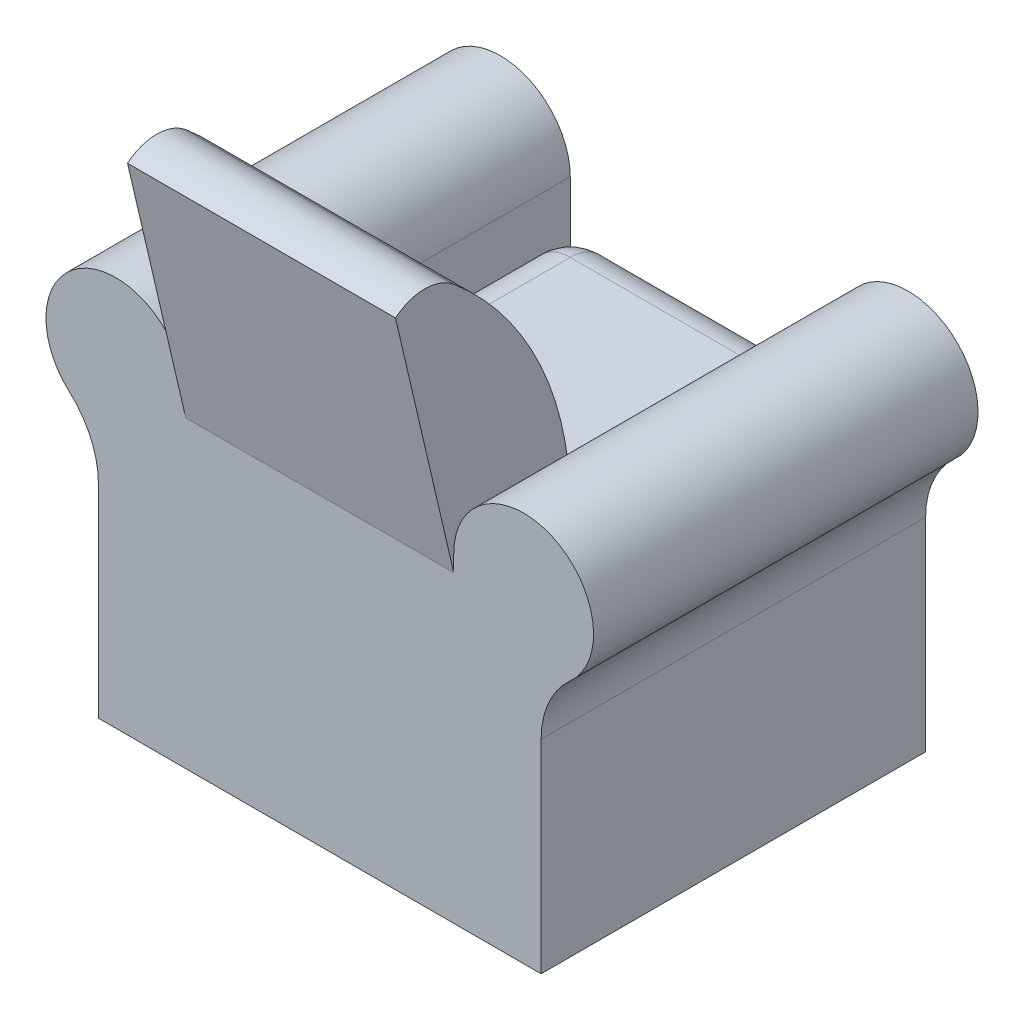
ISO-10303-21;
HEADER;
FILE_DESCRIPTION(('STEP AP214'),'2;1');
FILE_NAME('part.step','',(''),(''),'','','');
FILE_SCHEMA(('AUTOMOTIVE_DESIGN { 1 0 10303 214 1 1 1 1 }'));
ENDSEC;
DATA;
#1=APPLICATION_CONTEXT('core data for automotive mechanical design processes');
#2=APPLICATION_PROTOCOL_DEFINITION('international standard','automotive_design',2000,#1);
#3=PRODUCT_CONTEXT('',#1,'mechanical');
#4=PRODUCT('Part','Part','',(#3));
#5=PRODUCT_RELATED_PRODUCT_CATEGORY('part','',(#4));
#6=PRODUCT_DEFINITION_FORMATION('','',#4);
#7=PRODUCT_DEFINITION_CONTEXT('part definition',#1,'design');
#8=PRODUCT_DEFINITION('design','',#6,#7);
#9=PRODUCT_DEFINITION_SHAPE('','',#8);
#10=(LENGTH_UNIT() NAMED_UNIT(*) SI_UNIT(.MILLI.,.METRE.));
#11=(NAMED_UNIT(*) PLANE_ANGLE_UNIT() SI_UNIT($,.RADIAN.));
#12=(NAMED_UNIT(*) SI_UNIT($,.STERADIAN.) SOLID_ANGLE_UNIT());
#13=UNCERTAINTY_MEASURE_WITH_UNIT(LENGTH_MEASURE(1.E-05),#10,'distance_accuracy_value','');
#14=(GEOMETRIC_REPRESENTATION_CONTEXT(3) GLOBAL_UNCERTAINTY_ASSIGNED_CONTEXT((#13)) GLOBAL_UNIT_ASSIGNED_CONTEXT((#10,
#11,#12)) REPRESENTATION_CONTEXT('',''));
#15=CARTESIAN_POINT('',(0.,0.,0.));
#16=DIRECTION('',(0.,0.,1.));
#17=DIRECTION('',(1.,0.,0.));
#18=AXIS2_PLACEMENT_3D('',#15,#16,#17);
#19=CARTESIAN_POINT('',(1243.60088541004,0.,230.));
#20=DIRECTION('',(0.,0.,-1.));
#21=DIRECTION('',(0.,1.,0.));
#22=AXIS2_PLACEMENT_3D('',#19,#20,#21);
#23=PLANE('',#22);
#24=DIRECTION('',(0.,1.,0.));
#25=VECTOR('',#24,1.);
#26=CARTESIAN_POINT('',(230.,0.,230.));
#27=LINE('',#26,#25);
#28=CARTESIAN_POINT('',(230.,350.,230.));
#29=VERTEX_POINT('',#28);
#30=CARTESIAN_POINT('',(230.,521.319166654697,230.));
#31=VERTEX_POINT('',#30);
#32=EDGE_CURVE('E440',#29,#31,#27,.T.);
#33=ORIENTED_EDGE('',*,*,#32,.F.);
#34=DIRECTION('',(1.,0.,0.));
#35=VECTOR('',#34,1.);
#36=CARTESIAN_POINT('',(230.,350.,230.));
#37=LINE('',#36,#35);
#38=CARTESIAN_POINT('',(-230.,350.,230.));
#39=VERTEX_POINT('',#38);
#40=EDGE_CURVE('E465',#39,#29,#37,.T.);
#41=ORIENTED_EDGE('',*,*,#40,.F.);
#42=DIRECTION('',(0.,-1.,0.));
#43=VECTOR('',#42,1.);
#44=CARTESIAN_POINT('',(-230.,0.,230.));
#45=LINE('',#44,#43);
#46=CARTESIAN_POINT('',(-230.,521.319166654697,230.));
#47=VERTEX_POINT('',#46);
#48=EDGE_CURVE('E450',#47,#39,#45,.T.);
#49=ORIENTED_EDGE('',*,*,#48,.F.);
#50=DIRECTION('',(-1.,0.,0.));
#51=VECTOR('',#50,1.);
#52=CARTESIAN_POINT('',(1243.60088541004,521.319166654697,230.));
#53=LINE('',#52,#51);
#54=EDGE_CURVE('E434',#31,#47,#53,.T.);
#55=ORIENTED_EDGE('',*,*,#54,.F.);
#56=EDGE_LOOP('',(#33,#41,#49,#55));
#57=FACE_BOUND('',#56,.T.);
#58=DIRECTION('',(0.,-1.,0.));
#59=VECTOR('',#58,1.);
#60=CARTESIAN_POINT('',(-160.,500.,230.));
#61=LINE('',#60,#59);
#62=CARTESIAN_POINT('',(-160.,430.,230.));
#63=VERTEX_POINT('',#62);
#64=CARTESIAN_POINT('',(-160.,420.,230.));
#65=VERTEX_POINT('',#64);
#66=EDGE_CURVE('E361',#63,#65,#61,.T.);
#67=ORIENTED_EDGE('',*,*,#66,.T.);
#68=DIRECTION('',(1.,0.,0.));
#69=VECTOR('',#68,1.);
#70=CARTESIAN_POINT('',(-230.,420.,230.));
#71=LINE('',#70,#69);
#72=CARTESIAN_POINT('',(160.,420.,230.));
#73=VERTEX_POINT('',#72);
#74=EDGE_CURVE('E352',#65,#73,#71,.T.);
#75=ORIENTED_EDGE('',*,*,#74,.T.);
#76=DIRECTION('',(0.,-1.,0.));
#77=VECTOR('',#76,1.);
#78=CARTESIAN_POINT('',(160.,500.,230.));
#79=LINE('',#78,#77);
#80=CARTESIAN_POINT('',(160.,430.,230.));
#81=VERTEX_POINT('',#80);
#82=EDGE_CURVE('E355',#73,#81,#79,.F.);
#83=ORIENTED_EDGE('',*,*,#82,.T.);
#84=DIRECTION('',(1.,0.,0.));
#85=VECTOR('',#84,1.);
#86=CARTESIAN_POINT('',(-230.,430.,230.));
#87=LINE('',#86,#85);
#88=EDGE_CURVE('E358',#81,#63,#87,.F.);
#89=ORIENTED_EDGE('',*,*,#88,.T.);
#90=EDGE_LOOP('',(#67,#75,#83,#89));
#91=FACE_BOUND('',#90,.T.);
#92=ADVANCED_FACE('F45',(#57,#91),#23,.T.);
#93=CARTESIAN_POINT('',(-230.,350.,230.));
#94=DIRECTION('',(1.,0.,0.));
#95=DIRECTION('',(0.,0.,-1.));
#96=AXIS2_PLACEMENT_3D('',#93,#94,#95);
#97=PLANE('',#96);
#98=DIRECTION('',(0.,0.,-1.));
#99=VECTOR('',#98,1.);
#100=CARTESIAN_POINT('',(-230.,550.,1141.68813394632));
#101=LINE('',#100,#99);
#102=CARTESIAN_POINT('',(-230.,550.,430.));
#103=VERTEX_POINT('',#102);
#104=CARTESIAN_POINT('',(-230.,550.,230.735703223161));
#105=VERTEX_POINT('',#104);
#106=EDGE_CURVE('E61',#103,#105,#101,.T.);
#107=ORIENTED_EDGE('',*,*,#106,.F.);
#108=DIRECTION('',(0.,-1.,0.));
#109=VECTOR('',#108,1.);
#110=CARTESIAN_POINT('',(-230.,0.,430.));
#111=LINE('',#110,#109);
#112=CARTESIAN_POINT('',(-230.,521.319166654697,430.));
#113=VERTEX_POINT('',#112);
#114=EDGE_CURVE('E259',#103,#113,#111,.T.);
#115=ORIENTED_EDGE('',*,*,#114,.T.);
#116=DIRECTION('',(0.,0.973854041122295,0.227174616957473));
#117=VECTOR('',#116,1.);
#118=CARTESIAN_POINT('',(-230.,950.,530.));
#119=LINE('',#118,#117);
#120=CARTESIAN_POINT('',(-230.,950.,530.));
#121=VERTEX_POINT('',#120);
#122=EDGE_CURVE('E364',#113,#121,#119,.T.);
#123=ORIENTED_EDGE('',*,*,#122,.T.);
#124=CARTESIAN_POINT('',(-230.,890.364608373908,480.));
#125=DIRECTION('',(-1.,0.,0.));
#126=DIRECTION('',(0.,0.,-1.));
#127=AXIS2_PLACEMENT_3D('',#124,#125,#126);
#128=CIRCLE('',#127,77.8227468957335);
#129=CARTESIAN_POINT('',(-230.,950.,430.));
#130=VERTEX_POINT('',#129);
#131=EDGE_CURVE('E445',#121,#130,#128,.T.);
#132=ORIENTED_EDGE('',*,*,#131,.T.);
#133=CARTESIAN_POINT('',(-230.,521.319166654697,789.418142194057));
#134=DIRECTION('',(-1.,0.,0.));
#135=DIRECTION('',(0.,0.,-1.));
#136=AXIS2_PLACEMENT_3D('',#133,#134,#135);
#137=CIRCLE('',#136,559.418142194057);
#138=EDGE_CURVE('E448',#130,#105,#137,.T.);
#139=ORIENTED_EDGE('',*,*,#138,.T.);
#140=EDGE_LOOP('',(#107,#115,#123,#132,#139));
#141=FACE_BOUND('',#140,.T.);
#142=ADVANCED_FACE('F47',(#141),#97,.F.);
#143=CARTESIAN_POINT('',(230.,350.,230.));
#144=DIRECTION('',(-1.,0.,0.));
#145=DIRECTION('',(0.,0.,1.));
#146=AXIS2_PLACEMENT_3D('',#143,#144,#145);
#147=PLANE('',#146);
#148=DIRECTION('',(0.,-0.973854041122295,-0.227174616957473));
#149=VECTOR('',#148,1.);
#150=CARTESIAN_POINT('',(230.,950.,530.));
#151=LINE('',#150,#149);
#152=CARTESIAN_POINT('',(230.,950.,530.));
#153=VERTEX_POINT('',#152);
#154=CARTESIAN_POINT('',(230.,521.319166654697,430.));
#155=VERTEX_POINT('',#154);
#156=EDGE_CURVE('E431',#153,#155,#151,.T.);
#157=ORIENTED_EDGE('',*,*,#156,.T.);
#158=DIRECTION('',(0.,1.,0.));
#159=VECTOR('',#158,1.);
#160=CARTESIAN_POINT('',(230.,0.,430.));
#161=LINE('',#160,#159);
#162=CARTESIAN_POINT('',(230.,550.,430.));
#163=VERTEX_POINT('',#162);
#164=EDGE_CURVE('E69',#155,#163,#161,.T.);
#165=ORIENTED_EDGE('',*,*,#164,.T.);
#166=DIRECTION('',(0.,0.,-1.));
#167=VECTOR('',#166,1.);
#168=CARTESIAN_POINT('',(230.,550.,1141.68813394632));
#169=LINE('',#168,#167);
#170=CARTESIAN_POINT('',(230.,550.,230.735703223161));
#171=VERTEX_POINT('',#170);
#172=EDGE_CURVE('E271',#163,#171,#169,.T.);
#173=ORIENTED_EDGE('',*,*,#172,.T.);
#174=CARTESIAN_POINT('',(230.,521.319166654697,789.418142194057));
#175=DIRECTION('',(-1.,0.,0.));
#176=DIRECTION('',(0.,0.,1.));
#177=AXIS2_PLACEMENT_3D('',#174,#175,#176);
#178=CIRCLE('',#177,559.418142194057);
#179=CARTESIAN_POINT('',(230.,950.,430.));
#180=VERTEX_POINT('',#179);
#181=EDGE_CURVE('E436',#171,#180,#178,.F.);
#182=ORIENTED_EDGE('',*,*,#181,.T.);
#183=CARTESIAN_POINT('',(230.,890.364608373908,480.));
#184=DIRECTION('',(-1.,0.,0.));
#185=DIRECTION('',(0.,0.,1.));
#186=AXIS2_PLACEMENT_3D('',#183,#184,#185);
#187=CIRCLE('',#186,77.8227468957335);
#188=EDGE_CURVE('E433',#180,#153,#187,.F.);
#189=ORIENTED_EDGE('',*,*,#188,.T.);
#190=EDGE_LOOP('',(#157,#165,#173,#182,#189));
#191=FACE_BOUND('',#190,.T.);
#192=ADVANCED_FACE('F515',(#191),#147,.F.);
#193=CARTESIAN_POINT('',(230.,350.,-230.));
#194=DIRECTION('',(0.,0.,1.));
#195=DIRECTION('',(1.,0.,0.));
#196=AXIS2_PLACEMENT_3D('',#193,#194,#195);
#197=PLANE('',#196);
#198=DIRECTION('',(-1.,0.,0.));
#199=VECTOR('',#198,1.);
#200=CARTESIAN_POINT('',(230.,0.,-230.));
#201=LINE('',#200,#199);
#202=CARTESIAN_POINT('',(380.,0.,-230.));
#203=VERTEX_POINT('',#202);
#204=CARTESIAN_POINT('',(-380.,0.,-230.));
#205=VERTEX_POINT('',#204);
#206=EDGE_CURVE('E49',#203,#205,#201,.T.);
#207=ORIENTED_EDGE('',*,*,#206,.T.);
#208=DIRECTION('',(0.,1.,0.));
#209=VECTOR('',#208,1.);
#210=CARTESIAN_POINT('',(-380.,348.753882025019,-230.));
#211=LINE('',#210,#209);
#212=CARTESIAN_POINT('',(-380.,348.753882025019,-230.));
#213=VERTEX_POINT('',#212);
#214=EDGE_CURVE('E257',#205,#213,#211,.T.);
#215=ORIENTED_EDGE('',*,*,#214,.T.);
#216=CARTESIAN_POINT('',(-530.,348.753882025019,-230.));
#217=DIRECTION('',(0.,0.,1.));
#218=DIRECTION('',(-1.,0.,0.));
#219=AXIS2_PLACEMENT_3D('',#216,#217,#218);
#220=CIRCLE('',#219,150.);
#221=CARTESIAN_POINT('',(-430.,460.557280900008,-230.));
#222=VERTEX_POINT('',#221);
#223=EDGE_CURVE('E242',#213,#222,#220,.T.);
#224=ORIENTED_EDGE('',*,*,#223,.T.);
#225=CARTESIAN_POINT('',(-350.,550.,-230.));
#226=DIRECTION('',(0.,0.,-1.));
#227=DIRECTION('',(1.,0.,0.));
#228=AXIS2_PLACEMENT_3D('',#225,#226,#227);
#229=CIRCLE('',#228,120.);
#230=CARTESIAN_POINT('',(-230.,550.,-230.));
#231=VERTEX_POINT('',#230);
#232=EDGE_CURVE('E253',#222,#231,#229,.T.);
#233=ORIENTED_EDGE('',*,*,#232,.T.);
#234=DIRECTION('',(0.,-1.,0.));
#235=VECTOR('',#234,1.);
#236=CARTESIAN_POINT('',(-230.,0.,-230.));
#237=LINE('',#236,#235);
#238=CARTESIAN_POINT('',(-230.,350.,-230.));
#239=VERTEX_POINT('',#238);
#240=EDGE_CURVE('E250',#231,#239,#237,.T.);
#241=ORIENTED_EDGE('',*,*,#240,.T.);
#242=DIRECTION('',(-1.,0.,0.));
#243=VECTOR('',#242,1.);
#244=CARTESIAN_POINT('',(230.,350.,-230.));
#245=LINE('',#244,#243);
#246=CARTESIAN_POINT('',(230.,350.,-230.));
#247=VERTEX_POINT('',#246);
#248=EDGE_CURVE('E11',#247,#239,#245,.T.);
#249=ORIENTED_EDGE('',*,*,#248,.F.);
#250=DIRECTION('',(0.,1.,0.));
#251=VECTOR('',#250,1.);
#252=CARTESIAN_POINT('',(230.,0.,-230.));
#253=LINE('',#252,#251);
#254=CARTESIAN_POINT('',(230.,550.,-230.));
#255=VERTEX_POINT('',#254);
#256=EDGE_CURVE('E291',#247,#255,#253,.T.);
#257=ORIENTED_EDGE('',*,*,#256,.T.);
#258=CARTESIAN_POINT('',(350.,550.,-230.));
#259=DIRECTION('',(0.,0.,-1.));
#260=DIRECTION('',(-1.,0.,0.));
#261=AXIS2_PLACEMENT_3D('',#258,#259,#260);
#262=CIRCLE('',#261,120.);
#263=CARTESIAN_POINT('',(430.,460.557280900008,-230.));
#264=VERTEX_POINT('',#263);
#265=EDGE_CURVE('E293',#255,#264,#262,.T.);
#266=ORIENTED_EDGE('',*,*,#265,.T.);
#267=CARTESIAN_POINT('',(530.,348.753882025019,-230.));
#268=DIRECTION('',(0.,0.,1.));
#269=DIRECTION('',(1.,0.,0.));
#270=AXIS2_PLACEMENT_3D('',#267,#268,#269);
#271=CIRCLE('',#270,150.);
#272=CARTESIAN_POINT('',(380.,348.753882025019,-230.));
#273=VERTEX_POINT('',#272);
#274=EDGE_CURVE('E281',#264,#273,#271,.T.);
#275=ORIENTED_EDGE('',*,*,#274,.T.);
#276=DIRECTION('',(0.,-1.,0.));
#277=VECTOR('',#276,1.);
#278=CARTESIAN_POINT('',(380.,348.753882025019,-230.));
#279=LINE('',#278,#277);
#280=EDGE_CURVE('E288',#273,#203,#279,.T.);
#281=ORIENTED_EDGE('',*,*,#280,.T.);
#282=EDGE_LOOP('',(#207,#215,#224,#233,#241,#249,#257,#266,#275,#281));
#283=FACE_BOUND('',#282,.T.);
#284=ADVANCED_FACE('F477',(#283),#197,.F.);
#285=CARTESIAN_POINT('',(0.,350.,0.));
#286=DIRECTION('',(0.,1.,0.));
#287=DIRECTION('',(0.,0.,1.));
#288=AXIS2_PLACEMENT_3D('',#285,#286,#287);
#289=PLANE('',#288);
#290=DIRECTION('',(1.,0.,0.));
#291=VECTOR('',#290,1.);
#292=CARTESIAN_POINT('',(0.,350.,160.));
#293=LINE('',#292,#291);
#294=CARTESIAN_POINT('',(160.,350.,160.));
#295=VERTEX_POINT('',#294);
#296=CARTESIAN_POINT('',(-160.,350.,160.));
#297=VERTEX_POINT('',#296);
#298=EDGE_CURVE('E320',#295,#297,#293,.F.);
#299=ORIENTED_EDGE('',*,*,#298,.T.);
#300=DIRECTION('',(0.,0.,1.));
#301=VECTOR('',#300,1.);
#302=CARTESIAN_POINT('',(-160.,350.,0.));
#303=LINE('',#302,#301);
#304=CARTESIAN_POINT('',(-160.,350.,-160.));
#305=VERTEX_POINT('',#304);
#306=EDGE_CURVE('E324',#297,#305,#303,.F.);
#307=ORIENTED_EDGE('',*,*,#306,.T.);
#308=DIRECTION('',(-1.,0.,0.));
#309=VECTOR('',#308,1.);
#310=CARTESIAN_POINT('',(0.,350.,-160.));
#311=LINE('',#310,#309);
#312=CARTESIAN_POINT('',(160.,350.,-160.));
#313=VERTEX_POINT('',#312);
#314=EDGE_CURVE('E326',#305,#313,#311,.F.);
#315=ORIENTED_EDGE('',*,*,#314,.T.);
#316=DIRECTION('',(0.,0.,-1.));
#317=VECTOR('',#316,1.);
#318=CARTESIAN_POINT('',(160.,350.,0.));
#319=LINE('',#318,#317);
#320=EDGE_CURVE('E322',#313,#295,#319,.F.);
#321=ORIENTED_EDGE('',*,*,#320,.T.);
#322=EDGE_LOOP('',(#299,#307,#315,#321));
#323=FACE_BOUND('',#322,.T.);
#324=DIRECTION('',(0.,0.,1.));
#325=VECTOR('',#324,1.);
#326=CARTESIAN_POINT('',(-230.,350.,230.));
#327=LINE('',#326,#325);
#328=EDGE_CURVE('E463',#239,#39,#327,.T.);
#329=ORIENTED_EDGE('',*,*,#328,.T.);
#330=ORIENTED_EDGE('',*,*,#40,.T.);
#331=DIRECTION('',(0.,0.,-1.));
#332=VECTOR('',#331,1.);
#333=CARTESIAN_POINT('',(230.,350.,230.));
#334=LINE('',#333,#332);
#335=EDGE_CURVE('E54',#29,#247,#334,.T.);
#336=ORIENTED_EDGE('',*,*,#335,.T.);
#337=ORIENTED_EDGE('',*,*,#248,.T.);
#338=EDGE_LOOP('',(#329,#330,#336,#337));
#339=FACE_BOUND('',#338,.T.);
#340=ADVANCED_FACE('F470',(#323,#339),#289,.T.);
#341=CARTESIAN_POINT('',(0.,0.,0.));
#342=DIRECTION('',(0.,1.,0.));
#343=DIRECTION('',(0.,0.,1.));
#344=AXIS2_PLACEMENT_3D('',#341,#342,#343);
#345=PLANE('',#344);
#346=DIRECTION('',(-1.,0.,0.));
#347=VECTOR('',#346,1.);
#348=CARTESIAN_POINT('',(1243.60088541004,0.,430.));
#349=LINE('',#348,#347);
#350=CARTESIAN_POINT('',(380.,0.,430.));
#351=VERTEX_POINT('',#350);
#352=CARTESIAN_POINT('',(-380.,0.,430.));
#353=VERTEX_POINT('',#352);
#354=EDGE_CURVE('E453',#351,#353,#349,.T.);
#355=ORIENTED_EDGE('',*,*,#354,.T.);
#356=DIRECTION('',(0.,0.,-1.));
#357=VECTOR('',#356,1.);
#358=CARTESIAN_POINT('',(-380.,0.,1141.68813394632));
#359=LINE('',#358,#357);
#360=EDGE_CURVE('E249',#353,#205,#359,.T.);
#361=ORIENTED_EDGE('',*,*,#360,.T.);
#362=ORIENTED_EDGE('',*,*,#206,.F.);
#363=DIRECTION('',(0.,0.,-1.));
#364=VECTOR('',#363,1.);
#365=CARTESIAN_POINT('',(380.,0.,1141.68813394632));
#366=LINE('',#365,#364);
#367=EDGE_CURVE('E267',#351,#203,#366,.T.);
#368=ORIENTED_EDGE('',*,*,#367,.F.);
#369=EDGE_LOOP('',(#355,#361,#362,#368));
#370=FACE_BOUND('',#369,.T.);
#371=ADVANCED_FACE('F498',(#370),#345,.F.);
#372=CARTESIAN_POINT('',(1243.60088541004,521.319166654697,789.418142194057));
#373=DIRECTION('',(-1.,0.,0.));
#374=DIRECTION('',(0.,0.,1.));
#375=AXIS2_PLACEMENT_3D('',#372,#373,#374);
#376=CYLINDRICAL_SURFACE('',#375,559.418142194057);
#377=EDGE_CURVE('E437',#31,#171,#178,.F.);
#378=ORIENTED_EDGE('',*,*,#377,.F.);
#379=ORIENTED_EDGE('',*,*,#54,.T.);
#380=CARTESIAN_POINT('',(-230.,521.319166654697,789.418142194057));
#381=DIRECTION('',(1.,0.,0.));
#382=DIRECTION('',(0.,0.,-1.));
#383=AXIS2_PLACEMENT_3D('',#380,#381,#382);
#384=CIRCLE('',#383,559.418142194057);
#385=EDGE_CURVE('E266',#105,#47,#384,.F.);
#386=ORIENTED_EDGE('',*,*,#385,.F.);
#387=ORIENTED_EDGE('',*,*,#138,.F.);
#388=DIRECTION('',(-1.,0.,0.));
#389=VECTOR('',#388,1.);
#390=CARTESIAN_POINT('',(1243.60088541004,950.,430.));
#391=LINE('',#390,#389);
#392=EDGE_CURVE('E455',#180,#130,#391,.T.);
#393=ORIENTED_EDGE('',*,*,#392,.F.);
#394=ORIENTED_EDGE('',*,*,#181,.F.);
#395=EDGE_LOOP('',(#378,#379,#386,#387,#393,#394));
#396=FACE_BOUND('',#395,.T.);
#397=ADVANCED_FACE('F510',(#396),#376,.T.);
#398=CARTESIAN_POINT('',(1243.60088541004,890.364608373908,480.));
#399=DIRECTION('',(-1.,0.,0.));
#400=DIRECTION('',(0.,0.,1.));
#401=AXIS2_PLACEMENT_3D('',#398,#399,#400);
#402=CYLINDRICAL_SURFACE('',#401,77.8227468957335);
#403=ORIENTED_EDGE('',*,*,#188,.F.);
#404=ORIENTED_EDGE('',*,*,#392,.T.);
#405=ORIENTED_EDGE('',*,*,#131,.F.);
#406=DIRECTION('',(-1.,0.,0.));
#407=VECTOR('',#406,1.);
#408=CARTESIAN_POINT('',(1243.60088541004,950.,530.));
#409=LINE('',#408,#407);
#410=EDGE_CURVE('E457',#153,#121,#409,.T.);
#411=ORIENTED_EDGE('',*,*,#410,.F.);
#412=EDGE_LOOP('',(#403,#404,#405,#411));
#413=FACE_BOUND('',#412,.T.);
#414=ADVANCED_FACE('F519',(#413),#402,.T.);
#415=CARTESIAN_POINT('',(1243.60088541004,950.,530.));
#416=DIRECTION('',(0.,-0.227174616957473,0.973854041122295));
#417=DIRECTION('',(0.,-0.973854041122295,-0.227174616957473));
#418=AXIS2_PLACEMENT_3D('',#415,#416,#417);
#419=PLANE('',#418);
#420=ORIENTED_EDGE('',*,*,#156,.F.);
#421=ORIENTED_EDGE('',*,*,#410,.T.);
#422=ORIENTED_EDGE('',*,*,#122,.F.);
#423=DIRECTION('',(-1.,0.,0.));
#424=VECTOR('',#423,1.);
#425=CARTESIAN_POINT('',(1243.60088541004,521.319166654697,430.));
#426=LINE('',#425,#424);
#427=EDGE_CURVE('E459',#155,#113,#426,.T.);
#428=ORIENTED_EDGE('',*,*,#427,.F.);
#429=EDGE_LOOP('',(#420,#421,#422,#428));
#430=FACE_BOUND('',#429,.T.);
#431=ADVANCED_FACE('F522',(#430),#419,.T.);
#432=CARTESIAN_POINT('',(1243.60088541004,521.319166654697,430.));
#433=DIRECTION('',(0.,0.,1.));
#434=DIRECTION('',(0.,-1.,0.));
#435=AXIS2_PLACEMENT_3D('',#432,#433,#434);
#436=PLANE('',#435);
#437=ORIENTED_EDGE('',*,*,#354,.F.);
#438=DIRECTION('',(0.,-1.,0.));
#439=VECTOR('',#438,1.);
#440=CARTESIAN_POINT('',(380.,348.753882025019,430.));
#441=LINE('',#440,#439);
#442=CARTESIAN_POINT('',(380.,348.753882025019,430.));
#443=VERTEX_POINT('',#442);
#444=EDGE_CURVE('E270',#443,#351,#441,.T.);
#445=ORIENTED_EDGE('',*,*,#444,.F.);
#446=CARTESIAN_POINT('',(530.,348.753882025019,430.));
#447=DIRECTION('',(0.,0.,1.));
#448=DIRECTION('',(0.,-1.,0.));
#449=AXIS2_PLACEMENT_3D('',#446,#447,#448);
#450=CIRCLE('',#449,150.);
#451=CARTESIAN_POINT('',(430.,460.557280900008,430.));
#452=VERTEX_POINT('',#451);
#453=EDGE_CURVE('E277',#452,#443,#450,.T.);
#454=ORIENTED_EDGE('',*,*,#453,.F.);
#455=CARTESIAN_POINT('',(350.,550.,430.));
#456=DIRECTION('',(0.,0.,1.));
#457=DIRECTION('',(0.,-1.,0.));
#458=AXIS2_PLACEMENT_3D('',#455,#456,#457);
#459=CIRCLE('',#458,120.);
#460=EDGE_CURVE('E276',#163,#452,#459,.F.);
#461=ORIENTED_EDGE('',*,*,#460,.F.);
#462=ORIENTED_EDGE('',*,*,#164,.F.);
#463=ORIENTED_EDGE('',*,*,#427,.T.);
#464=ORIENTED_EDGE('',*,*,#114,.F.);
#465=CARTESIAN_POINT('',(-350.,550.,430.));
#466=DIRECTION('',(0.,0.,1.));
#467=DIRECTION('',(0.,-1.,0.));
#468=AXIS2_PLACEMENT_3D('',#465,#466,#467);
#469=CIRCLE('',#468,120.);
#470=CARTESIAN_POINT('',(-430.,460.557280900008,430.));
#471=VERTEX_POINT('',#470);
#472=EDGE_CURVE('E233',#471,#103,#469,.F.);
#473=ORIENTED_EDGE('',*,*,#472,.F.);
#474=CARTESIAN_POINT('',(-530.,348.753882025019,430.));
#475=DIRECTION('',(0.,0.,1.));
#476=DIRECTION('',(0.,-1.,0.));
#477=AXIS2_PLACEMENT_3D('',#474,#475,#476);
#478=CIRCLE('',#477,150.);
#479=CARTESIAN_POINT('',(-380.,348.753882025019,430.));
#480=VERTEX_POINT('',#479);
#481=EDGE_CURVE('E226',#480,#471,#478,.T.);
#482=ORIENTED_EDGE('',*,*,#481,.F.);
#483=DIRECTION('',(0.,1.,0.));
#484=VECTOR('',#483,1.);
#485=CARTESIAN_POINT('',(-380.,348.753882025019,430.));
#486=LINE('',#485,#484);
#487=EDGE_CURVE('E230',#353,#480,#486,.T.);
#488=ORIENTED_EDGE('',*,*,#487,.F.);
#489=EDGE_LOOP('',(#437,#445,#454,#461,#462,#463,#464,#473,#482,#488));
#490=FACE_BOUND('',#489,.T.);
#491=ADVANCED_FACE('F228',(#490),#436,.T.);
#492=CARTESIAN_POINT('',(230.,500.,-230.));
#493=DIRECTION('',(0.,0.,1.));
#494=DIRECTION('',(1.,0.,0.));
#495=AXIS2_PLACEMENT_3D('',#492,#493,#494);
#496=PLANE('',#495);
#497=DIRECTION('',(-1.,0.,0.));
#498=VECTOR('',#497,1.);
#499=CARTESIAN_POINT('',(230.,420.,-230.));
#500=LINE('',#499,#498);
#501=CARTESIAN_POINT('',(160.,420.,-230.));
#502=VERTEX_POINT('',#501);
#503=CARTESIAN_POINT('',(-160.,420.,-230.));
#504=VERTEX_POINT('',#503);
#505=EDGE_CURVE('E313',#502,#504,#500,.T.);
#506=ORIENTED_EDGE('',*,*,#505,.T.);
#507=DIRECTION('',(0.,-1.,0.));
#508=VECTOR('',#507,1.);
#509=CARTESIAN_POINT('',(-160.,500.,-230.));
#510=LINE('',#509,#508);
#511=CARTESIAN_POINT('',(-160.,430.,-230.));
#512=VERTEX_POINT('',#511);
#513=EDGE_CURVE('E318',#504,#512,#510,.F.);
#514=ORIENTED_EDGE('',*,*,#513,.T.);
#515=DIRECTION('',(-1.,0.,0.));
#516=VECTOR('',#515,1.);
#517=CARTESIAN_POINT('',(230.,430.,-230.));
#518=LINE('',#517,#516);
#519=CARTESIAN_POINT('',(160.,430.,-230.));
#520=VERTEX_POINT('',#519);
#521=EDGE_CURVE('E315',#512,#520,#518,.F.);
#522=ORIENTED_EDGE('',*,*,#521,.T.);
#523=DIRECTION('',(0.,-1.,0.));
#524=VECTOR('',#523,1.);
#525=CARTESIAN_POINT('',(160.,500.,-230.));
#526=LINE('',#525,#524);
#527=EDGE_CURVE('E311',#520,#502,#526,.T.);
#528=ORIENTED_EDGE('',*,*,#527,.T.);
#529=EDGE_LOOP('',(#506,#514,#522,#528));
#530=FACE_BOUND('',#529,.T.);
#531=ADVANCED_FACE('F544',(#530),#496,.F.);
#532=CARTESIAN_POINT('',(0.,500.,0.));
#533=DIRECTION('',(0.,1.,0.));
#534=DIRECTION('',(0.,0.,1.));
#535=AXIS2_PLACEMENT_3D('',#532,#533,#534);
#536=PLANE('',#535);
#537=DIRECTION('',(0.,0.,-1.));
#538=VECTOR('',#537,1.);
#539=CARTESIAN_POINT('',(160.,500.,-230.));
#540=LINE('',#539,#538);
#541=CARTESIAN_POINT('',(160.,500.,160.));
#542=VERTEX_POINT('',#541);
#543=CARTESIAN_POINT('',(160.,500.,-160.));
#544=VERTEX_POINT('',#543);
#545=EDGE_CURVE('E303',#542,#544,#540,.T.);
#546=ORIENTED_EDGE('',*,*,#545,.T.);
#547=DIRECTION('',(-1.,0.,0.));
#548=VECTOR('',#547,1.);
#549=CARTESIAN_POINT('',(-230.,500.,-160.));
#550=LINE('',#549,#548);
#551=CARTESIAN_POINT('',(-160.,500.,-160.));
#552=VERTEX_POINT('',#551);
#553=EDGE_CURVE('E308',#544,#552,#550,.T.);
#554=ORIENTED_EDGE('',*,*,#553,.T.);
#555=DIRECTION('',(0.,0.,1.));
#556=VECTOR('',#555,1.);
#557=CARTESIAN_POINT('',(-160.,500.,230.));
#558=LINE('',#557,#556);
#559=CARTESIAN_POINT('',(-160.,500.,160.));
#560=VERTEX_POINT('',#559);
#561=EDGE_CURVE('E306',#552,#560,#558,.T.);
#562=ORIENTED_EDGE('',*,*,#561,.T.);
#563=DIRECTION('',(1.,0.,0.));
#564=VECTOR('',#563,1.);
#565=CARTESIAN_POINT('',(230.,500.,160.));
#566=LINE('',#565,#564);
#567=EDGE_CURVE('E301',#560,#542,#566,.T.);
#568=ORIENTED_EDGE('',*,*,#567,.T.);
#569=EDGE_LOOP('',(#546,#554,#562,#568));
#570=FACE_BOUND('',#569,.T.);
#571=ADVANCED_FACE('F586',(#570),#536,.T.);
#572=CARTESIAN_POINT('',(-230.,420.,160.));
#573=DIRECTION('',(1.,0.,0.));
#574=DIRECTION('',(0.,0.,-1.));
#575=AXIS2_PLACEMENT_3D('',#572,#573,#574);
#576=CYLINDRICAL_SURFACE('',#575,70.);
#577=CARTESIAN_POINT('',(160.,420.,160.));
#578=DIRECTION('',(1.,0.,0.));
#579=DIRECTION('',(0.,0.,-1.));
#580=AXIS2_PLACEMENT_3D('',#577,#578,#579);
#581=CIRCLE('',#580,70.);
#582=EDGE_CURVE('E304',#73,#295,#581,.T.);
#583=ORIENTED_EDGE('',*,*,#582,.F.);
#584=ORIENTED_EDGE('',*,*,#74,.F.);
#585=CARTESIAN_POINT('',(-160.,420.,160.));
#586=DIRECTION('',(-1.,0.,0.));
#587=DIRECTION('',(0.,0.,1.));
#588=AXIS2_PLACEMENT_3D('',#585,#586,#587);
#589=CIRCLE('',#588,70.);
#590=EDGE_CURVE('E426',#297,#65,#589,.T.);
#591=ORIENTED_EDGE('',*,*,#590,.F.);
#592=ORIENTED_EDGE('',*,*,#298,.F.);
#593=EDGE_LOOP('',(#583,#584,#591,#592));
#594=FACE_BOUND('',#593,.T.);
#595=ADVANCED_FACE('F534',(#594),#576,.T.);
#596=CARTESIAN_POINT('',(160.,420.,160.));
#597=DIRECTION('',(0.,-1.,0.));
#598=DIRECTION('',(0.,0.,-1.));
#599=AXIS2_PLACEMENT_3D('',#596,#597,#598);
#600=SPHERICAL_SURFACE('',#599,70.);
#601=CARTESIAN_POINT('',(160.,420.,160.));
#602=DIRECTION('',(0.,-1.,0.));
#603=DIRECTION('',(0.,0.,-1.));
#604=AXIS2_PLACEMENT_3D('',#601,#602,#603);
#605=CIRCLE('',#604,70.);
#606=CARTESIAN_POINT('',(230.,420.,160.));
#607=VERTEX_POINT('',#606);
#608=EDGE_CURVE('E421',#73,#607,#605,.F.);
#609=ORIENTED_EDGE('',*,*,#608,.F.);
#610=ORIENTED_EDGE('',*,*,#582,.T.);
#611=CARTESIAN_POINT('',(160.,420.,160.));
#612=DIRECTION('',(0.,0.,1.));
#613=DIRECTION('',(1.,0.,0.));
#614=AXIS2_PLACEMENT_3D('',#611,#612,#613);
#615=CIRCLE('',#614,70.);
#616=EDGE_CURVE('E423',#607,#295,#615,.F.);
#617=ORIENTED_EDGE('',*,*,#616,.F.);
#618=EDGE_LOOP('',(#609,#610,#617));
#619=FACE_BOUND('',#618,.T.);
#620=ADVANCED_FACE('F585',(#619),#600,.T.);
#621=CARTESIAN_POINT('',(-160.,420.,160.));
#622=DIRECTION('',(0.,0.,1.));
#623=DIRECTION('',(1.,0.,0.));
#624=AXIS2_PLACEMENT_3D('',#621,#622,#623);
#625=SPHERICAL_SURFACE('',#624,70.);
#626=CARTESIAN_POINT('',(-160.,420.,160.));
#627=DIRECTION('',(0.,0.,1.));
#628=DIRECTION('',(1.,0.,0.));
#629=AXIS2_PLACEMENT_3D('',#626,#627,#628);
#630=CIRCLE('',#629,70.);
#631=CARTESIAN_POINT('',(-230.,420.,160.));
#632=VERTEX_POINT('',#631);
#633=EDGE_CURVE('E416',#297,#632,#630,.F.);
#634=ORIENTED_EDGE('',*,*,#633,.F.);
#635=ORIENTED_EDGE('',*,*,#590,.T.);
#636=CARTESIAN_POINT('',(-160.,420.,160.));
#637=DIRECTION('',(0.,-1.,0.));
#638=DIRECTION('',(0.,0.,-1.));
#639=AXIS2_PLACEMENT_3D('',#636,#637,#638);
#640=CIRCLE('',#639,70.);
#641=EDGE_CURVE('E418',#632,#65,#640,.F.);
#642=ORIENTED_EDGE('',*,*,#641,.F.);
#643=EDGE_LOOP('',(#634,#635,#642));
#644=FACE_BOUND('',#643,.T.);
#645=ADVANCED_FACE('F593',(#644),#625,.T.);
#646=CARTESIAN_POINT('',(160.,420.,230.));
#647=DIRECTION('',(0.,0.,-1.));
#648=DIRECTION('',(-1.,0.,0.));
#649=AXIS2_PLACEMENT_3D('',#646,#647,#648);
#650=CYLINDRICAL_SURFACE('',#649,70.);
#651=ORIENTED_EDGE('',*,*,#616,.T.);
#652=ORIENTED_EDGE('',*,*,#320,.F.);
#653=CARTESIAN_POINT('',(160.,420.,-160.));
#654=DIRECTION('',(0.,0.,-1.));
#655=DIRECTION('',(-1.,0.,0.));
#656=AXIS2_PLACEMENT_3D('',#653,#654,#655);
#657=CIRCLE('',#656,70.);
#658=CARTESIAN_POINT('',(230.,420.,-160.));
#659=VERTEX_POINT('',#658);
#660=EDGE_CURVE('E410',#659,#313,#657,.T.);
#661=ORIENTED_EDGE('',*,*,#660,.F.);
#662=DIRECTION('',(0.,0.,-1.));
#663=VECTOR('',#662,1.);
#664=CARTESIAN_POINT('',(230.,420.,230.));
#665=LINE('',#664,#663);
#666=EDGE_CURVE('E343',#607,#659,#665,.T.);
#667=ORIENTED_EDGE('',*,*,#666,.F.);
#668=EDGE_LOOP('',(#651,#652,#661,#667));
#669=FACE_BOUND('',#668,.T.);
#670=ADVANCED_FACE('F600',(#669),#650,.T.);
#671=CARTESIAN_POINT('',(160.,500.,160.));
#672=DIRECTION('',(0.,-1.,0.));
#673=DIRECTION('',(0.,0.,-1.));
#674=AXIS2_PLACEMENT_3D('',#671,#672,#673);
#675=CYLINDRICAL_SURFACE('',#674,70.);
#676=ORIENTED_EDGE('',*,*,#608,.T.);
#677=DIRECTION('',(0.,-1.,0.));
#678=VECTOR('',#677,1.);
#679=CARTESIAN_POINT('',(230.,500.,160.));
#680=LINE('',#679,#678);
#681=CARTESIAN_POINT('',(230.,430.,160.));
#682=VERTEX_POINT('',#681);
#683=EDGE_CURVE('E340',#682,#607,#680,.T.);
#684=ORIENTED_EDGE('',*,*,#683,.F.);
#685=CARTESIAN_POINT('',(160.,430.,160.));
#686=DIRECTION('',(0.,1.,0.));
#687=DIRECTION('',(0.,0.,1.));
#688=AXIS2_PLACEMENT_3D('',#685,#686,#687);
#689=CIRCLE('',#688,70.);
#690=EDGE_CURVE('E407',#81,#682,#689,.T.);
#691=ORIENTED_EDGE('',*,*,#690,.F.);
#692=ORIENTED_EDGE('',*,*,#82,.F.);
#693=EDGE_LOOP('',(#676,#684,#691,#692));
#694=FACE_BOUND('',#693,.T.);
#695=ADVANCED_FACE('F608',(#694),#675,.T.);
#696=CARTESIAN_POINT('',(0.,430.,160.));
#697=DIRECTION('',(-1.,0.,0.));
#698=DIRECTION('',(0.,0.,1.));
#699=AXIS2_PLACEMENT_3D('',#696,#697,#698);
#700=CYLINDRICAL_SURFACE('',#699,70.);
#701=CARTESIAN_POINT('',(-160.,430.,160.));
#702=DIRECTION('',(-1.,0.,0.));
#703=DIRECTION('',(0.,0.,1.));
#704=AXIS2_PLACEMENT_3D('',#701,#702,#703);
#705=CIRCLE('',#704,70.);
#706=EDGE_CURVE('E401',#63,#560,#705,.T.);
#707=ORIENTED_EDGE('',*,*,#706,.F.);
#708=ORIENTED_EDGE('',*,*,#88,.F.);
#709=CARTESIAN_POINT('',(160.,430.,160.));
#710=DIRECTION('',(1.,0.,0.));
#711=DIRECTION('',(0.,0.,-1.));
#712=AXIS2_PLACEMENT_3D('',#709,#710,#711);
#713=CIRCLE('',#712,70.);
#714=EDGE_CURVE('E404',#542,#81,#713,.T.);
#715=ORIENTED_EDGE('',*,*,#714,.F.);
#716=ORIENTED_EDGE('',*,*,#567,.F.);
#717=EDGE_LOOP('',(#707,#708,#715,#716));
#718=FACE_BOUND('',#717,.T.);
#719=ADVANCED_FACE('F616',(#718),#700,.T.);
#720=CARTESIAN_POINT('',(-160.,500.,160.));
#721=DIRECTION('',(0.,-1.,0.));
#722=DIRECTION('',(0.,0.,-1.));
#723=AXIS2_PLACEMENT_3D('',#720,#721,#722);
#724=CYLINDRICAL_SURFACE('',#723,70.);
#725=ORIENTED_EDGE('',*,*,#641,.T.);
#726=ORIENTED_EDGE('',*,*,#66,.F.);
#727=CARTESIAN_POINT('',(-160.,430.,160.));
#728=DIRECTION('',(0.,1.,0.));
#729=DIRECTION('',(0.,0.,1.));
#730=AXIS2_PLACEMENT_3D('',#727,#728,#729);
#731=CIRCLE('',#730,70.);
#732=CARTESIAN_POINT('',(-230.,430.,160.));
#733=VERTEX_POINT('',#732);
#734=EDGE_CURVE('E398',#733,#63,#731,.T.);
#735=ORIENTED_EDGE('',*,*,#734,.F.);
#736=DIRECTION('',(0.,-1.,0.));
#737=VECTOR('',#736,1.);
#738=CARTESIAN_POINT('',(-230.,500.,160.));
#739=LINE('',#738,#737);
#740=EDGE_CURVE('E328',#632,#733,#739,.F.);
#741=ORIENTED_EDGE('',*,*,#740,.F.);
#742=EDGE_LOOP('',(#725,#726,#735,#741));
#743=FACE_BOUND('',#742,.T.);
#744=ADVANCED_FACE('F624',(#743),#724,.T.);
#745=CARTESIAN_POINT('',(-160.,420.,-230.));
#746=DIRECTION('',(0.,0.,1.));
#747=DIRECTION('',(1.,0.,0.));
#748=AXIS2_PLACEMENT_3D('',#745,#746,#747);
#749=CYLINDRICAL_SURFACE('',#748,70.);
#750=ORIENTED_EDGE('',*,*,#633,.T.);
#751=DIRECTION('',(0.,0.,1.));
#752=VECTOR('',#751,1.);
#753=CARTESIAN_POINT('',(-230.,420.,-230.));
#754=LINE('',#753,#752);
#755=CARTESIAN_POINT('',(-230.,420.,-160.));
#756=VERTEX_POINT('',#755);
#757=EDGE_CURVE('E331',#756,#632,#754,.T.);
#758=ORIENTED_EDGE('',*,*,#757,.F.);
#759=CARTESIAN_POINT('',(-160.,420.,-160.));
#760=DIRECTION('',(0.,0.,-1.));
#761=DIRECTION('',(-1.,0.,0.));
#762=AXIS2_PLACEMENT_3D('',#759,#760,#761);
#763=CIRCLE('',#762,70.);
#764=EDGE_CURVE('E395',#305,#756,#763,.T.);
#765=ORIENTED_EDGE('',*,*,#764,.F.);
#766=ORIENTED_EDGE('',*,*,#306,.F.);
#767=EDGE_LOOP('',(#750,#758,#765,#766));
#768=FACE_BOUND('',#767,.T.);
#769=ADVANCED_FACE('F632',(#768),#749,.T.);
#770=CARTESIAN_POINT('',(230.,420.,-160.));
#771=DIRECTION('',(-1.,0.,0.));
#772=DIRECTION('',(0.,0.,1.));
#773=AXIS2_PLACEMENT_3D('',#770,#771,#772);
#774=CYLINDRICAL_SURFACE('',#773,70.);
#775=CARTESIAN_POINT('',(160.,420.,-160.));
#776=DIRECTION('',(1.,0.,0.));
#777=DIRECTION('',(0.,0.,-1.));
#778=AXIS2_PLACEMENT_3D('',#775,#776,#777);
#779=CIRCLE('',#778,70.);
#780=EDGE_CURVE('E413',#313,#502,#779,.T.);
#781=ORIENTED_EDGE('',*,*,#780,.F.);
#782=ORIENTED_EDGE('',*,*,#314,.F.);
#783=CARTESIAN_POINT('',(-160.,420.,-160.));
#784=DIRECTION('',(-1.,0.,0.));
#785=DIRECTION('',(0.,0.,1.));
#786=AXIS2_PLACEMENT_3D('',#783,#784,#785);
#787=CIRCLE('',#786,70.);
#788=EDGE_CURVE('E392',#504,#305,#787,.T.);
#789=ORIENTED_EDGE('',*,*,#788,.F.);
#790=ORIENTED_EDGE('',*,*,#505,.F.);
#791=EDGE_LOOP('',(#781,#782,#789,#790));
#792=FACE_BOUND('',#791,.T.);
#793=ADVANCED_FACE('F640',(#792),#774,.T.);
#794=CARTESIAN_POINT('',(160.,420.,-160.));
#795=DIRECTION('',(0.,-1.,0.));
#796=DIRECTION('',(0.,0.,-1.));
#797=AXIS2_PLACEMENT_3D('',#794,#795,#796);
#798=SPHERICAL_SURFACE('',#797,70.);
#799=ORIENTED_EDGE('',*,*,#660,.T.);
#800=ORIENTED_EDGE('',*,*,#780,.T.);
#801=CARTESIAN_POINT('',(160.,420.,-160.));
#802=DIRECTION('',(0.,-1.,0.));
#803=DIRECTION('',(0.,0.,-1.));
#804=AXIS2_PLACEMENT_3D('',#801,#802,#803);
#805=CIRCLE('',#804,70.);
#806=EDGE_CURVE('E389',#659,#502,#805,.F.);
#807=ORIENTED_EDGE('',*,*,#806,.F.);
#808=EDGE_LOOP('',(#799,#800,#807));
#809=FACE_BOUND('',#808,.T.);
#810=ADVANCED_FACE('F648',(#809),#798,.T.);
#811=CARTESIAN_POINT('',(160.,430.,160.));
#812=DIRECTION('',(0.,0.,1.));
#813=DIRECTION('',(1.,0.,0.));
#814=AXIS2_PLACEMENT_3D('',#811,#812,#813);
#815=SPHERICAL_SURFACE('',#814,70.);
#816=ORIENTED_EDGE('',*,*,#714,.T.);
#817=ORIENTED_EDGE('',*,*,#690,.T.);
#818=CARTESIAN_POINT('',(160.,430.,160.));
#819=DIRECTION('',(0.,0.,1.));
#820=DIRECTION('',(0.,-1.,0.));
#821=AXIS2_PLACEMENT_3D('',#818,#819,#820);
#822=CIRCLE('',#821,70.);
#823=EDGE_CURVE('E386',#542,#682,#822,.F.);
#824=ORIENTED_EDGE('',*,*,#823,.F.);
#825=EDGE_LOOP('',(#816,#817,#824));
#826=FACE_BOUND('',#825,.T.);
#827=ADVANCED_FACE('F656',(#826),#815,.T.);
#828=CARTESIAN_POINT('',(-160.,430.,160.));
#829=DIRECTION('',(0.,0.,1.));
#830=DIRECTION('',(1.,0.,0.));
#831=AXIS2_PLACEMENT_3D('',#828,#829,#830);
#832=SPHERICAL_SURFACE('',#831,70.);
#833=ORIENTED_EDGE('',*,*,#734,.T.);
#834=ORIENTED_EDGE('',*,*,#706,.T.);
#835=CARTESIAN_POINT('',(-160.,430.,160.));
#836=DIRECTION('',(0.,0.,1.));
#837=DIRECTION('',(1.,0.,0.));
#838=AXIS2_PLACEMENT_3D('',#835,#836,#837);
#839=CIRCLE('',#838,70.);
#840=EDGE_CURVE('E383',#733,#560,#839,.F.);
#841=ORIENTED_EDGE('',*,*,#840,.F.);
#842=EDGE_LOOP('',(#833,#834,#841));
#843=FACE_BOUND('',#842,.T.);
#844=ADVANCED_FACE('F664',(#843),#832,.T.);
#845=CARTESIAN_POINT('',(-160.,420.,-160.));
#846=DIRECTION('',(0.,-1.,0.));
#847=DIRECTION('',(0.,0.,-1.));
#848=AXIS2_PLACEMENT_3D('',#845,#846,#847);
#849=SPHERICAL_SURFACE('',#848,70.);
#850=ORIENTED_EDGE('',*,*,#788,.T.);
#851=ORIENTED_EDGE('',*,*,#764,.T.);
#852=CARTESIAN_POINT('',(-160.,420.,-160.));
#853=DIRECTION('',(0.,-1.,0.));
#854=DIRECTION('',(0.,0.,-1.));
#855=AXIS2_PLACEMENT_3D('',#852,#853,#854);
#856=CIRCLE('',#855,70.);
#857=EDGE_CURVE('E380',#504,#756,#856,.F.);
#858=ORIENTED_EDGE('',*,*,#857,.F.);
#859=EDGE_LOOP('',(#850,#851,#858));
#860=FACE_BOUND('',#859,.T.);
#861=ADVANCED_FACE('F672',(#860),#849,.T.);
#862=CARTESIAN_POINT('',(160.,500.,-160.));
#863=DIRECTION('',(0.,-1.,0.));
#864=DIRECTION('',(0.,0.,-1.));
#865=AXIS2_PLACEMENT_3D('',#862,#863,#864);
#866=CYLINDRICAL_SURFACE('',#865,70.);
#867=ORIENTED_EDGE('',*,*,#806,.T.);
#868=ORIENTED_EDGE('',*,*,#527,.F.);
#869=CARTESIAN_POINT('',(160.,430.,-160.));
#870=DIRECTION('',(0.,1.,0.));
#871=DIRECTION('',(0.,0.,1.));
#872=AXIS2_PLACEMENT_3D('',#869,#870,#871);
#873=CIRCLE('',#872,70.);
#874=CARTESIAN_POINT('',(230.,430.,-160.));
#875=VERTEX_POINT('',#874);
#876=EDGE_CURVE('E377',#875,#520,#873,.T.);
#877=ORIENTED_EDGE('',*,*,#876,.F.);
#878=DIRECTION('',(0.,-1.,0.));
#879=VECTOR('',#878,1.);
#880=CARTESIAN_POINT('',(230.,500.,-160.));
#881=LINE('',#880,#879);
#882=EDGE_CURVE('E346',#659,#875,#881,.F.);
#883=ORIENTED_EDGE('',*,*,#882,.F.);
#884=EDGE_LOOP('',(#867,#868,#877,#883));
#885=FACE_BOUND('',#884,.T.);
#886=ADVANCED_FACE('F680',(#885),#866,.T.);
#887=CARTESIAN_POINT('',(160.,430.,0.));
#888=DIRECTION('',(0.,0.,1.));
#889=DIRECTION('',(1.,0.,0.));
#890=AXIS2_PLACEMENT_3D('',#887,#888,#889);
#891=CYLINDRICAL_SURFACE('',#890,70.);
#892=ORIENTED_EDGE('',*,*,#823,.T.);
#893=DIRECTION('',(0.,0.,-1.));
#894=VECTOR('',#893,1.);
#895=CARTESIAN_POINT('',(230.,430.,230.));
#896=LINE('',#895,#894);
#897=EDGE_CURVE('E349',#875,#682,#896,.F.);
#898=ORIENTED_EDGE('',*,*,#897,.F.);
#899=CARTESIAN_POINT('',(160.,430.,-160.));
#900=DIRECTION('',(0.,0.,-1.));
#901=DIRECTION('',(-1.,0.,0.));
#902=AXIS2_PLACEMENT_3D('',#899,#900,#901);
#903=CIRCLE('',#902,70.);
#904=EDGE_CURVE('E374',#544,#875,#903,.T.);
#905=ORIENTED_EDGE('',*,*,#904,.F.);
#906=ORIENTED_EDGE('',*,*,#545,.F.);
#907=EDGE_LOOP('',(#892,#898,#905,#906));
#908=FACE_BOUND('',#907,.T.);
#909=ADVANCED_FACE('F688',(#908),#891,.T.);
#910=CARTESIAN_POINT('',(-160.,430.,0.));
#911=DIRECTION('',(0.,0.,-1.));
#912=DIRECTION('',(-1.,0.,0.));
#913=AXIS2_PLACEMENT_3D('',#910,#911,#912);
#914=CYLINDRICAL_SURFACE('',#913,70.);
#915=ORIENTED_EDGE('',*,*,#840,.T.);
#916=ORIENTED_EDGE('',*,*,#561,.F.);
#917=CARTESIAN_POINT('',(-160.,430.,-160.));
#918=DIRECTION('',(0.,0.,-1.));
#919=DIRECTION('',(0.,1.,0.));
#920=AXIS2_PLACEMENT_3D('',#917,#918,#919);
#921=CIRCLE('',#920,70.);
#922=CARTESIAN_POINT('',(-230.,430.,-160.));
#923=VERTEX_POINT('',#922);
#924=EDGE_CURVE('E371',#923,#552,#921,.T.);
#925=ORIENTED_EDGE('',*,*,#924,.F.);
#926=DIRECTION('',(0.,0.,1.));
#927=VECTOR('',#926,1.);
#928=CARTESIAN_POINT('',(-230.,430.,-230.));
#929=LINE('',#928,#927);
#930=EDGE_CURVE('E334',#733,#923,#929,.F.);
#931=ORIENTED_EDGE('',*,*,#930,.F.);
#932=EDGE_LOOP('',(#915,#916,#925,#931));
#933=FACE_BOUND('',#932,.T.);
#934=ADVANCED_FACE('F696',(#933),#914,.T.);
#935=CARTESIAN_POINT('',(-160.,500.,-160.));
#936=DIRECTION('',(0.,-1.,0.));
#937=DIRECTION('',(0.,0.,-1.));
#938=AXIS2_PLACEMENT_3D('',#935,#936,#937);
#939=CYLINDRICAL_SURFACE('',#938,70.);
#940=ORIENTED_EDGE('',*,*,#857,.T.);
#941=DIRECTION('',(0.,-1.,0.));
#942=VECTOR('',#941,1.);
#943=CARTESIAN_POINT('',(-230.,500.,-160.));
#944=LINE('',#943,#942);
#945=EDGE_CURVE('E337',#923,#756,#944,.T.);
#946=ORIENTED_EDGE('',*,*,#945,.F.);
#947=CARTESIAN_POINT('',(-160.,430.,-160.));
#948=DIRECTION('',(0.,1.,0.));
#949=DIRECTION('',(0.,0.,1.));
#950=AXIS2_PLACEMENT_3D('',#947,#948,#949);
#951=CIRCLE('',#950,70.);
#952=EDGE_CURVE('E368',#512,#923,#951,.T.);
#953=ORIENTED_EDGE('',*,*,#952,.F.);
#954=ORIENTED_EDGE('',*,*,#513,.F.);
#955=EDGE_LOOP('',(#940,#946,#953,#954));
#956=FACE_BOUND('',#955,.T.);
#957=ADVANCED_FACE('F704',(#956),#939,.T.);
#958=CARTESIAN_POINT('',(160.,430.,-160.));
#959=DIRECTION('',(1.,0.,0.));
#960=DIRECTION('',(0.,0.,-1.));
#961=AXIS2_PLACEMENT_3D('',#958,#959,#960);
#962=SPHERICAL_SURFACE('',#961,70.);
#963=ORIENTED_EDGE('',*,*,#904,.T.);
#964=ORIENTED_EDGE('',*,*,#876,.T.);
#965=CARTESIAN_POINT('',(160.,430.,-160.));
#966=DIRECTION('',(1.,0.,0.));
#967=DIRECTION('',(0.,0.,-1.));
#968=AXIS2_PLACEMENT_3D('',#965,#966,#967);
#969=CIRCLE('',#968,70.);
#970=EDGE_CURVE('E366',#544,#520,#969,.F.);
#971=ORIENTED_EDGE('',*,*,#970,.F.);
#972=EDGE_LOOP('',(#963,#964,#971));
#973=FACE_BOUND('',#972,.T.);
#974=ADVANCED_FACE('F712',(#973),#962,.T.);
#975=CARTESIAN_POINT('',(-160.,430.,-160.));
#976=DIRECTION('',(-1.,0.,0.));
#977=DIRECTION('',(0.,0.,1.));
#978=AXIS2_PLACEMENT_3D('',#975,#976,#977);
#979=SPHERICAL_SURFACE('',#978,70.);
#980=ORIENTED_EDGE('',*,*,#952,.T.);
#981=ORIENTED_EDGE('',*,*,#924,.T.);
#982=CARTESIAN_POINT('',(-160.,430.,-160.));
#983=DIRECTION('',(-1.,0.,0.));
#984=DIRECTION('',(0.,0.,1.));
#985=AXIS2_PLACEMENT_3D('',#982,#983,#984);
#986=CIRCLE('',#985,70.);
#987=EDGE_CURVE('E300',#512,#552,#986,.F.);
#988=ORIENTED_EDGE('',*,*,#987,.F.);
#989=EDGE_LOOP('',(#980,#981,#988));
#990=FACE_BOUND('',#989,.T.);
#991=ADVANCED_FACE('F720',(#990),#979,.T.);
#992=CARTESIAN_POINT('',(0.,430.,-160.));
#993=DIRECTION('',(1.,0.,0.));
#994=DIRECTION('',(0.,0.,-1.));
#995=AXIS2_PLACEMENT_3D('',#992,#993,#994);
#996=CYLINDRICAL_SURFACE('',#995,70.);
#997=ORIENTED_EDGE('',*,*,#970,.T.);
#998=ORIENTED_EDGE('',*,*,#521,.F.);
#999=ORIENTED_EDGE('',*,*,#987,.T.);
#1000=ORIENTED_EDGE('',*,*,#553,.F.);
#1001=EDGE_LOOP('',(#997,#998,#999,#1000));
#1002=FACE_BOUND('',#1001,.T.);
#1003=ADVANCED_FACE('F728',(#1002),#996,.T.);
#1004=CARTESIAN_POINT('',(-380.,348.753882025019,1141.68813394632));
#1005=DIRECTION('',(-1.,0.,0.));
#1006=DIRECTION('',(0.,-1.,0.));
#1007=AXIS2_PLACEMENT_3D('',#1004,#1005,#1006);
#1008=PLANE('',#1007);
#1009=ORIENTED_EDGE('',*,*,#360,.F.);
#1010=ORIENTED_EDGE('',*,*,#487,.T.);
#1011=DIRECTION('',(0.,0.,-1.));
#1012=VECTOR('',#1011,1.);
#1013=CARTESIAN_POINT('',(-380.,348.753882025019,1141.68813394632));
#1014=LINE('',#1013,#1012);
#1015=EDGE_CURVE('E237',#480,#213,#1014,.T.);
#1016=ORIENTED_EDGE('',*,*,#1015,.T.);
#1017=ORIENTED_EDGE('',*,*,#214,.F.);
#1018=EDGE_LOOP('',(#1009,#1010,#1016,#1017));
#1019=FACE_BOUND('',#1018,.T.);
#1020=ADVANCED_FACE('F247',(#1019),#1008,.T.);
#1021=CARTESIAN_POINT('',(-530.,348.753882025019,1141.68813394632));
#1022=DIRECTION('',(0.,0.,-1.));
#1023=DIRECTION('',(-1.,0.,0.));
#1024=AXIS2_PLACEMENT_3D('',#1021,#1022,#1023);
#1025=CYLINDRICAL_SURFACE('',#1024,150.);
#1026=ORIENTED_EDGE('',*,*,#1015,.F.);
#1027=ORIENTED_EDGE('',*,*,#481,.T.);
#1028=DIRECTION('',(0.,0.,-1.));
#1029=VECTOR('',#1028,1.);
#1030=CARTESIAN_POINT('',(-430.,460.557280900008,1141.68813394632));
#1031=LINE('',#1030,#1029);
#1032=EDGE_CURVE('E236',#471,#222,#1031,.T.);
#1033=ORIENTED_EDGE('',*,*,#1032,.T.);
#1034=ORIENTED_EDGE('',*,*,#223,.F.);
#1035=EDGE_LOOP('',(#1026,#1027,#1033,#1034));
#1036=FACE_BOUND('',#1035,.T.);
#1037=ADVANCED_FACE('F240',(#1036),#1025,.F.);
#1038=CARTESIAN_POINT('',(-350.,550.,1141.68813394632));
#1039=DIRECTION('',(0.,0.,-1.));
#1040=DIRECTION('',(-1.,0.,0.));
#1041=AXIS2_PLACEMENT_3D('',#1038,#1039,#1040);
#1042=CYLINDRICAL_SURFACE('',#1041,120.);
#1043=ORIENTED_EDGE('',*,*,#1032,.F.);
#1044=ORIENTED_EDGE('',*,*,#472,.T.);
#1045=ORIENTED_EDGE('',*,*,#106,.T.);
#1046=EDGE_CURVE('E261',#105,#231,#101,.T.);
#1047=ORIENTED_EDGE('',*,*,#1046,.T.);
#1048=ORIENTED_EDGE('',*,*,#232,.F.);
#1049=EDGE_LOOP('',(#1043,#1044,#1045,#1047,#1048));
#1050=FACE_BOUND('',#1049,.T.);
#1051=ADVANCED_FACE('F749',(#1050),#1042,.T.);
#1052=CARTESIAN_POINT('',(-230.,0.,1141.68813394632));
#1053=DIRECTION('',(1.,0.,0.));
#1054=DIRECTION('',(0.,0.,-1.));
#1055=AXIS2_PLACEMENT_3D('',#1052,#1053,#1054);
#1056=PLANE('',#1055);
#1057=ORIENTED_EDGE('',*,*,#757,.T.);
#1058=ORIENTED_EDGE('',*,*,#740,.T.);
#1059=ORIENTED_EDGE('',*,*,#930,.T.);
#1060=ORIENTED_EDGE('',*,*,#945,.T.);
#1061=EDGE_LOOP('',(#1057,#1058,#1059,#1060));
#1062=FACE_BOUND('',#1061,.T.);
#1063=ORIENTED_EDGE('',*,*,#48,.T.);
#1064=ORIENTED_EDGE('',*,*,#328,.F.);
#1065=ORIENTED_EDGE('',*,*,#240,.F.);
#1066=ORIENTED_EDGE('',*,*,#1046,.F.);
#1067=ORIENTED_EDGE('',*,*,#385,.T.);
#1068=EDGE_LOOP('',(#1063,#1064,#1065,#1066,#1067));
#1069=FACE_BOUND('',#1068,.T.);
#1070=ADVANCED_FACE('F504',(#1062,#1069),#1056,.T.);
#1071=CARTESIAN_POINT('',(230.,0.,1141.68813394632));
#1072=DIRECTION('',(-1.,0.,0.));
#1073=DIRECTION('',(0.,0.,1.));
#1074=AXIS2_PLACEMENT_3D('',#1071,#1072,#1073);
#1075=PLANE('',#1074);
#1076=ORIENTED_EDGE('',*,*,#256,.F.);
#1077=ORIENTED_EDGE('',*,*,#335,.F.);
#1078=ORIENTED_EDGE('',*,*,#32,.T.);
#1079=ORIENTED_EDGE('',*,*,#377,.T.);
#1080=EDGE_CURVE('E273',#171,#255,#169,.T.);
#1081=ORIENTED_EDGE('',*,*,#1080,.T.);
#1082=EDGE_LOOP('',(#1076,#1077,#1078,#1079,#1081));
#1083=FACE_BOUND('',#1082,.T.);
#1084=ORIENTED_EDGE('',*,*,#666,.T.);
#1085=ORIENTED_EDGE('',*,*,#882,.T.);
#1086=ORIENTED_EDGE('',*,*,#897,.T.);
#1087=ORIENTED_EDGE('',*,*,#683,.T.);
#1088=EDGE_LOOP('',(#1084,#1085,#1086,#1087));
#1089=FACE_BOUND('',#1088,.T.);
#1090=ADVANCED_FACE('F481',(#1083,#1089),#1075,.T.);
#1091=CARTESIAN_POINT('',(350.,550.,1141.68813394632));
#1092=DIRECTION('',(0.,0.,-1.));
#1093=DIRECTION('',(-1.,0.,0.));
#1094=AXIS2_PLACEMENT_3D('',#1091,#1092,#1093);
#1095=CYLINDRICAL_SURFACE('',#1094,120.);
#1096=ORIENTED_EDGE('',*,*,#172,.F.);
#1097=ORIENTED_EDGE('',*,*,#460,.T.);
#1098=DIRECTION('',(0.,0.,-1.));
#1099=VECTOR('',#1098,1.);
#1100=CARTESIAN_POINT('',(430.,460.557280900008,1141.68813394632));
#1101=LINE('',#1100,#1099);
#1102=EDGE_CURVE('E274',#452,#264,#1101,.T.);
#1103=ORIENTED_EDGE('',*,*,#1102,.T.);
#1104=ORIENTED_EDGE('',*,*,#265,.F.);
#1105=ORIENTED_EDGE('',*,*,#1080,.F.);
#1106=EDGE_LOOP('',(#1096,#1097,#1103,#1104,#1105));
#1107=FACE_BOUND('',#1106,.T.);
#1108=ADVANCED_FACE('F487',(#1107),#1095,.T.);
#1109=CARTESIAN_POINT('',(530.000000000001,348.753882025019,1141.68813394632));
#1110=DIRECTION('',(0.,0.,-1.));
#1111=DIRECTION('',(-1.,0.,0.));
#1112=AXIS2_PLACEMENT_3D('',#1109,#1110,#1111);
#1113=CYLINDRICAL_SURFACE('',#1112,150.);
#1114=ORIENTED_EDGE('',*,*,#1102,.F.);
#1115=ORIENTED_EDGE('',*,*,#453,.T.);
#1116=DIRECTION('',(0.,0.,-1.));
#1117=VECTOR('',#1116,1.);
#1118=CARTESIAN_POINT('',(380.,348.753882025019,1141.68813394632));
#1119=LINE('',#1118,#1117);
#1120=EDGE_CURVE('E278',#443,#273,#1119,.T.);
#1121=ORIENTED_EDGE('',*,*,#1120,.T.);
#1122=ORIENTED_EDGE('',*,*,#274,.F.);
#1123=EDGE_LOOP('',(#1114,#1115,#1121,#1122));
#1124=FACE_BOUND('',#1123,.T.);
#1125=ADVANCED_FACE('F491',(#1124),#1113,.F.);
#1126=CARTESIAN_POINT('',(380.,348.753882025019,1141.68813394632));
#1127=DIRECTION('',(1.,0.,0.));
#1128=DIRECTION('',(0.,1.,0.));
#1129=AXIS2_PLACEMENT_3D('',#1126,#1127,#1128);
#1130=PLANE('',#1129);
#1131=ORIENTED_EDGE('',*,*,#1120,.F.);
#1132=ORIENTED_EDGE('',*,*,#444,.T.);
#1133=ORIENTED_EDGE('',*,*,#367,.T.);
#1134=ORIENTED_EDGE('',*,*,#280,.F.);
#1135=EDGE_LOOP('',(#1131,#1132,#1133,#1134));
#1136=FACE_BOUND('',#1135,.T.);
#1137=ADVANCED_FACE('F495',(#1136),#1130,.T.);
#1138=CLOSED_SHELL('',(#92,#142,#192,#284,#340,#371,#397,#414,#431,#491,#531,#571,#595,#620,
#645,#670,#695,#719,#744,#769,#793,#810,#827,#844,#861,#886,#909,#934,#957,#974,#991,#1003,
#1020,#1037,#1051,#1070,#1090,#1108,#1125,#1137));
#1139=MANIFOLD_SOLID_BREP('B2',#1138);
#1140=ADVANCED_BREP_SHAPE_REPRESENTATION('',(#18,#1139),#14);
#1141=SHAPE_DEFINITION_REPRESENTATION(#9,#1140);
ENDSEC;
END-ISO-10303-21;
